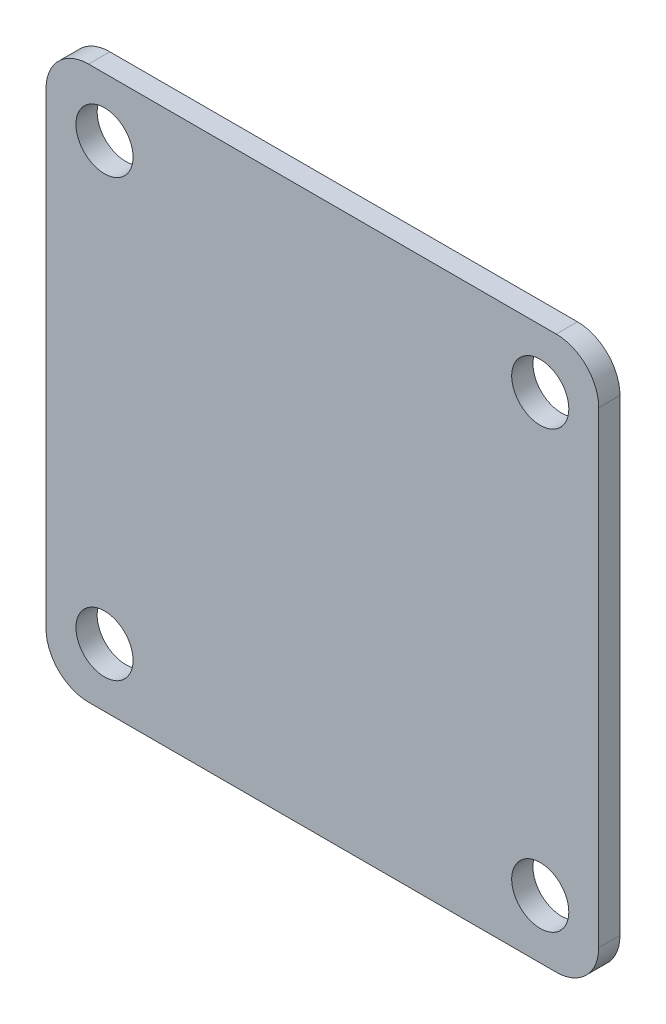
ISO-10303-21;
HEADER;
FILE_DESCRIPTION(('STEP AP214'),'2;1');
FILE_NAME('part.step','',(''),(''),'','','');
FILE_SCHEMA(('AUTOMOTIVE_DESIGN { 1 0 10303 214 1 1 1 1 }'));
ENDSEC;
DATA;
#1=APPLICATION_CONTEXT('core data for automotive mechanical design processes');
#2=APPLICATION_PROTOCOL_DEFINITION('international standard','automotive_design',2000,#1);
#3=PRODUCT_CONTEXT('',#1,'mechanical');
#4=PRODUCT('Part','Part','',(#3));
#5=PRODUCT_RELATED_PRODUCT_CATEGORY('part','',(#4));
#6=PRODUCT_DEFINITION_FORMATION('','',#4);
#7=PRODUCT_DEFINITION_CONTEXT('part definition',#1,'design');
#8=PRODUCT_DEFINITION('design','',#6,#7);
#9=PRODUCT_DEFINITION_SHAPE('','',#8);
#10=(LENGTH_UNIT() NAMED_UNIT(*) SI_UNIT(.MILLI.,.METRE.));
#11=(NAMED_UNIT(*) PLANE_ANGLE_UNIT() SI_UNIT($,.RADIAN.));
#12=(NAMED_UNIT(*) SI_UNIT($,.STERADIAN.) SOLID_ANGLE_UNIT());
#13=UNCERTAINTY_MEASURE_WITH_UNIT(LENGTH_MEASURE(1.E-05),#10,'distance_accuracy_value','');
#14=(GEOMETRIC_REPRESENTATION_CONTEXT(3) GLOBAL_UNCERTAINTY_ASSIGNED_CONTEXT((#13)) GLOBAL_UNIT_ASSIGNED_CONTEXT((#10,
#11,#12)) REPRESENTATION_CONTEXT('',''));
#15=CARTESIAN_POINT('',(0.,0.,0.));
#16=DIRECTION('',(0.,0.,1.));
#17=DIRECTION('',(1.,0.,0.));
#18=AXIS2_PLACEMENT_3D('',#15,#16,#17);
#19=CARTESIAN_POINT('',(-82.55,82.55,6.35));
#20=DIRECTION('',(0.,0.,-1.));
#21=DIRECTION('',(-1.,0.,0.));
#22=AXIS2_PLACEMENT_3D('',#19,#20,#21);
#23=PLANE('',#22);
#24=CARTESIAN_POINT('',(65.0874999999995,65.0875000000004,6.35));
#25=DIRECTION('',(0.,0.,1.));
#26=DIRECTION('',(1.,0.,0.));
#27=AXIS2_PLACEMENT_3D('',#24,#25,#26);
#28=CIRCLE('',#27,8.5328125);
#29=CARTESIAN_POINT('',(73.6203124999995,65.0875000000004,6.35));
#30=VERTEX_POINT('',#29);
#31=EDGE_CURVE('E184',#30,#30,#28,.T.);
#32=ORIENTED_EDGE('',*,*,#31,.F.);
#33=EDGE_LOOP('',(#32));
#34=FACE_BOUND('',#33,.T.);
#35=CARTESIAN_POINT('',(-65.0875,-65.0875,6.35));
#36=DIRECTION('',(0.,0.,1.));
#37=DIRECTION('',(1.,0.,0.));
#38=AXIS2_PLACEMENT_3D('',#35,#36,#37);
#39=CIRCLE('',#38,8.5328125);
#40=CARTESIAN_POINT('',(-56.5546875,-65.0875,6.35));
#41=VERTEX_POINT('',#40);
#42=EDGE_CURVE('E125',#41,#41,#39,.T.);
#43=ORIENTED_EDGE('',*,*,#42,.F.);
#44=EDGE_LOOP('',(#43));
#45=FACE_BOUND('',#44,.T.);
#46=DIRECTION('',(-1.,0.,0.));
#47=VECTOR('',#46,1.);
#48=CARTESIAN_POINT('',(-82.55,82.55,6.35));
#49=LINE('',#48,#47);
#50=CARTESIAN_POINT('',(69.85,82.55,6.35));
#51=VERTEX_POINT('',#50);
#52=CARTESIAN_POINT('',(-69.85,82.55,6.35));
#53=VERTEX_POINT('',#52);
#54=EDGE_CURVE('E134',#51,#53,#49,.T.);
#55=ORIENTED_EDGE('',*,*,#54,.T.);
#56=CARTESIAN_POINT('',(-69.85,69.85,6.35));
#57=DIRECTION('',(0.,0.,-1.));
#58=DIRECTION('',(-1.,0.,0.));
#59=AXIS2_PLACEMENT_3D('',#56,#57,#58);
#60=CIRCLE('',#59,12.7);
#61=CARTESIAN_POINT('',(-82.55,69.85,6.35));
#62=VERTEX_POINT('',#61);
#63=EDGE_CURVE('E153',#53,#62,#60,.F.);
#64=ORIENTED_EDGE('',*,*,#63,.T.);
#65=DIRECTION('',(0.,-1.,0.));
#66=VECTOR('',#65,1.);
#67=CARTESIAN_POINT('',(-82.55,-82.55,6.35));
#68=LINE('',#67,#66);
#69=CARTESIAN_POINT('',(-82.55,-69.85,6.35));
#70=VERTEX_POINT('',#69);
#71=EDGE_CURVE('E117',#62,#70,#68,.T.);
#72=ORIENTED_EDGE('',*,*,#71,.T.);
#73=CARTESIAN_POINT('',(-69.85,-69.85,6.35));
#74=DIRECTION('',(0.,0.,-1.));
#75=DIRECTION('',(-1.,0.,0.));
#76=AXIS2_PLACEMENT_3D('',#73,#74,#75);
#77=CIRCLE('',#76,12.7);
#78=CARTESIAN_POINT('',(-69.85,-82.55,6.35));
#79=VERTEX_POINT('',#78);
#80=EDGE_CURVE('E151',#70,#79,#77,.F.);
#81=ORIENTED_EDGE('',*,*,#80,.T.);
#82=DIRECTION('',(1.,0.,0.));
#83=VECTOR('',#82,1.);
#84=CARTESIAN_POINT('',(-82.55,-82.55,6.35));
#85=LINE('',#84,#83);
#86=CARTESIAN_POINT('',(69.85,-82.55,6.35));
#87=VERTEX_POINT('',#86);
#88=EDGE_CURVE('E164',#79,#87,#85,.T.);
#89=ORIENTED_EDGE('',*,*,#88,.T.);
#90=CARTESIAN_POINT('',(69.85,-69.85,6.35));
#91=DIRECTION('',(0.,0.,-1.));
#92=DIRECTION('',(-1.,0.,0.));
#93=AXIS2_PLACEMENT_3D('',#90,#91,#92);
#94=CIRCLE('',#93,12.7);
#95=CARTESIAN_POINT('',(82.55,-69.85,6.35));
#96=VERTEX_POINT('',#95);
#97=EDGE_CURVE('E52',#87,#96,#94,.F.);
#98=ORIENTED_EDGE('',*,*,#97,.T.);
#99=DIRECTION('',(0.,1.,0.));
#100=VECTOR('',#99,1.);
#101=CARTESIAN_POINT('',(82.55,-82.55,6.35));
#102=LINE('',#101,#100);
#103=CARTESIAN_POINT('',(82.55,69.85,6.35));
#104=VERTEX_POINT('',#103);
#105=EDGE_CURVE('E172',#96,#104,#102,.T.);
#106=ORIENTED_EDGE('',*,*,#105,.T.);
#107=CARTESIAN_POINT('',(69.85,69.85,6.35));
#108=DIRECTION('',(0.,0.,-1.));
#109=DIRECTION('',(-1.,0.,0.));
#110=AXIS2_PLACEMENT_3D('',#107,#108,#109);
#111=CIRCLE('',#110,12.7);
#112=EDGE_CURVE('E148',#104,#51,#111,.F.);
#113=ORIENTED_EDGE('',*,*,#112,.T.);
#114=EDGE_LOOP('',(#55,#64,#72,#81,#89,#98,#106,#113));
#115=FACE_BOUND('',#114,.T.);
#116=CARTESIAN_POINT('',(-65.0875000000007,65.0874999999993,6.35));
#117=DIRECTION('',(0.,0.,1.));
#118=DIRECTION('',(1.,0.,0.));
#119=AXIS2_PLACEMENT_3D('',#116,#117,#118);
#120=CIRCLE('',#119,8.5328125);
#121=CARTESIAN_POINT('',(-56.5546875000007,65.0874999999993,6.35));
#122=VERTEX_POINT('',#121);
#123=EDGE_CURVE('E179',#122,#122,#120,.T.);
#124=ORIENTED_EDGE('',*,*,#123,.F.);
#125=EDGE_LOOP('',(#124));
#126=FACE_BOUND('',#125,.T.);
#127=CARTESIAN_POINT('',(65.0875000000002,-65.0874999999998,6.35));
#128=DIRECTION('',(0.,0.,1.));
#129=DIRECTION('',(1.,0.,0.));
#130=AXIS2_PLACEMENT_3D('',#127,#128,#129);
#131=CIRCLE('',#130,8.5328125);
#132=CARTESIAN_POINT('',(73.6203125000002,-65.0874999999998,6.35));
#133=VERTEX_POINT('',#132);
#134=EDGE_CURVE('E190',#133,#133,#131,.T.);
#135=ORIENTED_EDGE('',*,*,#134,.F.);
#136=EDGE_LOOP('',(#135));
#137=FACE_BOUND('',#136,.T.);
#138=ADVANCED_FACE('F31',(#34,#45,#115,#126,#137),#23,.F.);
#139=CARTESIAN_POINT('',(-82.55,82.55,0.));
#140=DIRECTION('',(0.,0.,-1.));
#141=DIRECTION('',(-1.,0.,0.));
#142=AXIS2_PLACEMENT_3D('',#139,#140,#141);
#143=PLANE('',#142);
#144=CARTESIAN_POINT('',(65.0874999999995,65.0875000000004,0.));
#145=DIRECTION('',(0.,0.,1.));
#146=DIRECTION('',(1.,0.,0.));
#147=AXIS2_PLACEMENT_3D('',#144,#145,#146);
#148=CIRCLE('',#147,8.5328125);
#149=CARTESIAN_POINT('',(73.6203124999995,65.0875000000004,0.));
#150=VERTEX_POINT('',#149);
#151=EDGE_CURVE('E187',#150,#150,#148,.T.);
#152=ORIENTED_EDGE('',*,*,#151,.T.);
#153=EDGE_LOOP('',(#152));
#154=FACE_BOUND('',#153,.T.);
#155=CARTESIAN_POINT('',(-65.0875,-65.0875,0.));
#156=DIRECTION('',(0.,0.,1.));
#157=DIRECTION('',(1.,0.,0.));
#158=AXIS2_PLACEMENT_3D('',#155,#156,#157);
#159=CIRCLE('',#158,8.5328125);
#160=CARTESIAN_POINT('',(-56.5546875,-65.0875,0.));
#161=VERTEX_POINT('',#160);
#162=EDGE_CURVE('E131',#161,#161,#159,.T.);
#163=ORIENTED_EDGE('',*,*,#162,.T.);
#164=EDGE_LOOP('',(#163));
#165=FACE_BOUND('',#164,.T.);
#166=DIRECTION('',(0.,-1.,0.));
#167=VECTOR('',#166,1.);
#168=CARTESIAN_POINT('',(-82.55,-82.55,0.));
#169=LINE('',#168,#167);
#170=CARTESIAN_POINT('',(-82.55,69.85,0.));
#171=VERTEX_POINT('',#170);
#172=CARTESIAN_POINT('',(-82.55,-69.85,0.));
#173=VERTEX_POINT('',#172);
#174=EDGE_CURVE('E114',#171,#173,#169,.T.);
#175=ORIENTED_EDGE('',*,*,#174,.F.);
#176=CARTESIAN_POINT('',(-69.85,69.85,0.));
#177=DIRECTION('',(0.,0.,-1.));
#178=DIRECTION('',(-1.,0.,0.));
#179=AXIS2_PLACEMENT_3D('',#176,#177,#178);
#180=CIRCLE('',#179,12.7);
#181=CARTESIAN_POINT('',(-69.85,82.55,0.));
#182=VERTEX_POINT('',#181);
#183=EDGE_CURVE('E97',#171,#182,#180,.T.);
#184=ORIENTED_EDGE('',*,*,#183,.T.);
#185=DIRECTION('',(-1.,0.,0.));
#186=VECTOR('',#185,1.);
#187=CARTESIAN_POINT('',(-82.55,82.55,0.));
#188=LINE('',#187,#186);
#189=CARTESIAN_POINT('',(69.85,82.55,0.));
#190=VERTEX_POINT('',#189);
#191=EDGE_CURVE('E138',#190,#182,#188,.T.);
#192=ORIENTED_EDGE('',*,*,#191,.F.);
#193=CARTESIAN_POINT('',(69.85,69.85,0.));
#194=DIRECTION('',(0.,0.,-1.));
#195=DIRECTION('',(-1.,0.,0.));
#196=AXIS2_PLACEMENT_3D('',#193,#194,#195);
#197=CIRCLE('',#196,12.7);
#198=CARTESIAN_POINT('',(82.55,69.85,0.));
#199=VERTEX_POINT('',#198);
#200=EDGE_CURVE('E118',#190,#199,#197,.T.);
#201=ORIENTED_EDGE('',*,*,#200,.T.);
#202=DIRECTION('',(0.,1.,0.));
#203=VECTOR('',#202,1.);
#204=CARTESIAN_POINT('',(82.55,-82.55,0.));
#205=LINE('',#204,#203);
#206=CARTESIAN_POINT('',(82.55,-69.85,0.));
#207=VERTEX_POINT('',#206);
#208=EDGE_CURVE('E128',#207,#199,#205,.T.);
#209=ORIENTED_EDGE('',*,*,#208,.F.);
#210=CARTESIAN_POINT('',(69.85,-69.85,0.));
#211=DIRECTION('',(0.,0.,-1.));
#212=DIRECTION('',(-1.,0.,0.));
#213=AXIS2_PLACEMENT_3D('',#210,#211,#212);
#214=CIRCLE('',#213,12.7);
#215=CARTESIAN_POINT('',(69.85,-82.55,0.));
#216=VERTEX_POINT('',#215);
#217=EDGE_CURVE('E142',#207,#216,#214,.T.);
#218=ORIENTED_EDGE('',*,*,#217,.T.);
#219=DIRECTION('',(1.,0.,0.));
#220=VECTOR('',#219,1.);
#221=CARTESIAN_POINT('',(-82.55,-82.55,0.));
#222=LINE('',#221,#220);
#223=CARTESIAN_POINT('',(-69.85,-82.55,0.));
#224=VERTEX_POINT('',#223);
#225=EDGE_CURVE('E124',#224,#216,#222,.T.);
#226=ORIENTED_EDGE('',*,*,#225,.F.);
#227=CARTESIAN_POINT('',(-69.85,-69.85,0.));
#228=DIRECTION('',(0.,0.,-1.));
#229=DIRECTION('',(-1.,0.,0.));
#230=AXIS2_PLACEMENT_3D('',#227,#228,#229);
#231=CIRCLE('',#230,12.7);
#232=EDGE_CURVE('E108',#224,#173,#231,.T.);
#233=ORIENTED_EDGE('',*,*,#232,.T.);
#234=EDGE_LOOP('',(#175,#184,#192,#201,#209,#218,#226,#233));
#235=FACE_BOUND('',#234,.T.);
#236=CARTESIAN_POINT('',(-65.0875000000007,65.0874999999993,0.));
#237=DIRECTION('',(0.,0.,1.));
#238=DIRECTION('',(1.,0.,0.));
#239=AXIS2_PLACEMENT_3D('',#236,#237,#238);
#240=CIRCLE('',#239,8.5328125);
#241=CARTESIAN_POINT('',(-56.5546875000007,65.0874999999993,0.));
#242=VERTEX_POINT('',#241);
#243=EDGE_CURVE('E181',#242,#242,#240,.T.);
#244=ORIENTED_EDGE('',*,*,#243,.T.);
#245=EDGE_LOOP('',(#244));
#246=FACE_BOUND('',#245,.T.);
#247=CARTESIAN_POINT('',(65.0875000000002,-65.0874999999998,0.));
#248=DIRECTION('',(0.,0.,1.));
#249=DIRECTION('',(1.,0.,0.));
#250=AXIS2_PLACEMENT_3D('',#247,#248,#249);
#251=CIRCLE('',#250,8.5328125);
#252=CARTESIAN_POINT('',(73.6203125000002,-65.0874999999998,0.));
#253=VERTEX_POINT('',#252);
#254=EDGE_CURVE('E193',#253,#253,#251,.T.);
#255=ORIENTED_EDGE('',*,*,#254,.T.);
#256=EDGE_LOOP('',(#255));
#257=FACE_BOUND('',#256,.T.);
#258=ADVANCED_FACE('F121',(#154,#165,#235,#246,#257),#143,.T.);
#259=CARTESIAN_POINT('',(-82.55,-82.55,6.35));
#260=DIRECTION('',(1.,0.,0.));
#261=DIRECTION('',(0.,0.,-1.));
#262=AXIS2_PLACEMENT_3D('',#259,#260,#261);
#263=PLANE('',#262);
#264=ORIENTED_EDGE('',*,*,#71,.F.);
#265=DIRECTION('',(0.,0.,-1.));
#266=VECTOR('',#265,1.);
#267=CARTESIAN_POINT('',(-82.55,69.85,6.35));
#268=LINE('',#267,#266);
#269=EDGE_CURVE('E101',#62,#171,#268,.T.);
#270=ORIENTED_EDGE('',*,*,#269,.T.);
#271=ORIENTED_EDGE('',*,*,#174,.T.);
#272=DIRECTION('',(0.,0.,-1.));
#273=VECTOR('',#272,1.);
#274=CARTESIAN_POINT('',(-82.55,-69.85,6.35));
#275=LINE('',#274,#273);
#276=EDGE_CURVE('E119',#173,#70,#275,.F.);
#277=ORIENTED_EDGE('',*,*,#276,.T.);
#278=EDGE_LOOP('',(#264,#270,#271,#277));
#279=FACE_BOUND('',#278,.T.);
#280=ADVANCED_FACE('F113',(#279),#263,.F.);
#281=CARTESIAN_POINT('',(-82.55,-82.55,6.35));
#282=DIRECTION('',(0.,1.,0.));
#283=DIRECTION('',(0.,0.,1.));
#284=AXIS2_PLACEMENT_3D('',#281,#282,#283);
#285=PLANE('',#284);
#286=ORIENTED_EDGE('',*,*,#88,.F.);
#287=DIRECTION('',(0.,0.,-1.));
#288=VECTOR('',#287,1.);
#289=CARTESIAN_POINT('',(-69.85,-82.55,6.35));
#290=LINE('',#289,#288);
#291=EDGE_CURVE('E157',#79,#224,#290,.T.);
#292=ORIENTED_EDGE('',*,*,#291,.T.);
#293=ORIENTED_EDGE('',*,*,#225,.T.);
#294=DIRECTION('',(0.,0.,-1.));
#295=VECTOR('',#294,1.);
#296=CARTESIAN_POINT('',(69.85,-82.55,6.35));
#297=LINE('',#296,#295);
#298=EDGE_CURVE('E155',#216,#87,#297,.F.);
#299=ORIENTED_EDGE('',*,*,#298,.T.);
#300=EDGE_LOOP('',(#286,#292,#293,#299));
#301=FACE_BOUND('',#300,.T.);
#302=ADVANCED_FACE('F162',(#301),#285,.F.);
#303=CARTESIAN_POINT('',(82.55,-82.55,6.35));
#304=DIRECTION('',(-1.,0.,0.));
#305=DIRECTION('',(0.,0.,1.));
#306=AXIS2_PLACEMENT_3D('',#303,#304,#305);
#307=PLANE('',#306);
#308=ORIENTED_EDGE('',*,*,#105,.F.);
#309=DIRECTION('',(0.,0.,-1.));
#310=VECTOR('',#309,1.);
#311=CARTESIAN_POINT('',(82.55,-69.85,6.35));
#312=LINE('',#311,#310);
#313=EDGE_CURVE('E11',#96,#207,#312,.T.);
#314=ORIENTED_EDGE('',*,*,#313,.T.);
#315=ORIENTED_EDGE('',*,*,#208,.T.);
#316=DIRECTION('',(0.,0.,-1.));
#317=VECTOR('',#316,1.);
#318=CARTESIAN_POINT('',(82.55,69.85,6.35));
#319=LINE('',#318,#317);
#320=EDGE_CURVE('E39',#199,#104,#319,.F.);
#321=ORIENTED_EDGE('',*,*,#320,.T.);
#322=EDGE_LOOP('',(#308,#314,#315,#321));
#323=FACE_BOUND('',#322,.T.);
#324=ADVANCED_FACE('F171',(#323),#307,.F.);
#325=CARTESIAN_POINT('',(-82.55,82.55,6.35));
#326=DIRECTION('',(0.,-1.,0.));
#327=DIRECTION('',(0.,0.,-1.));
#328=AXIS2_PLACEMENT_3D('',#325,#326,#327);
#329=PLANE('',#328);
#330=ORIENTED_EDGE('',*,*,#191,.T.);
#331=DIRECTION('',(0.,0.,-1.));
#332=VECTOR('',#331,1.);
#333=CARTESIAN_POINT('',(-69.85,82.55,6.35));
#334=LINE('',#333,#332);
#335=EDGE_CURVE('E102',#182,#53,#334,.F.);
#336=ORIENTED_EDGE('',*,*,#335,.T.);
#337=ORIENTED_EDGE('',*,*,#54,.F.);
#338=DIRECTION('',(0.,0.,-1.));
#339=VECTOR('',#338,1.);
#340=CARTESIAN_POINT('',(69.85,82.55,6.35));
#341=LINE('',#340,#339);
#342=EDGE_CURVE('E107',#51,#190,#341,.T.);
#343=ORIENTED_EDGE('',*,*,#342,.T.);
#344=EDGE_LOOP('',(#330,#336,#337,#343));
#345=FACE_BOUND('',#344,.T.);
#346=ADVANCED_FACE('F216',(#345),#329,.F.);
#347=CARTESIAN_POINT('',(-65.0875,-65.0875,6.35));
#348=DIRECTION('',(0.,0.,-1.));
#349=DIRECTION('',(-1.,0.,0.));
#350=AXIS2_PLACEMENT_3D('',#347,#348,#349);
#351=CYLINDRICAL_SURFACE('',#350,8.5328125);
#352=ORIENTED_EDGE('',*,*,#42,.T.);
#353=EDGE_LOOP('',(#352));
#354=FACE_BOUND('',#353,.T.);
#355=ORIENTED_EDGE('',*,*,#162,.F.);
#356=EDGE_LOOP('',(#355));
#357=FACE_BOUND('',#356,.T.);
#358=ADVANCED_FACE('F213',(#354,#357),#351,.F.);
#359=CARTESIAN_POINT('',(-65.0875000000007,65.0874999999993,6.35));
#360=DIRECTION('',(0.,0.,-1.));
#361=DIRECTION('',(-1.,0.,0.));
#362=AXIS2_PLACEMENT_3D('',#359,#360,#361);
#363=CYLINDRICAL_SURFACE('',#362,8.5328125);
#364=ORIENTED_EDGE('',*,*,#123,.T.);
#365=EDGE_LOOP('',(#364));
#366=FACE_BOUND('',#365,.T.);
#367=ORIENTED_EDGE('',*,*,#243,.F.);
#368=EDGE_LOOP('',(#367));
#369=FACE_BOUND('',#368,.T.);
#370=ADVANCED_FACE('F242',(#366,#369),#363,.F.);
#371=CARTESIAN_POINT('',(65.0874999999995,65.0875000000004,6.35));
#372=DIRECTION('',(0.,0.,-1.));
#373=DIRECTION('',(-1.,0.,0.));
#374=AXIS2_PLACEMENT_3D('',#371,#372,#373);
#375=CYLINDRICAL_SURFACE('',#374,8.5328125);
#376=ORIENTED_EDGE('',*,*,#31,.T.);
#377=EDGE_LOOP('',(#376));
#378=FACE_BOUND('',#377,.T.);
#379=ORIENTED_EDGE('',*,*,#151,.F.);
#380=EDGE_LOOP('',(#379));
#381=FACE_BOUND('',#380,.T.);
#382=ADVANCED_FACE('F245',(#378,#381),#375,.F.);
#383=CARTESIAN_POINT('',(65.0875000000002,-65.0874999999998,6.35));
#384=DIRECTION('',(0.,0.,-1.));
#385=DIRECTION('',(-1.,0.,0.));
#386=AXIS2_PLACEMENT_3D('',#383,#384,#385);
#387=CYLINDRICAL_SURFACE('',#386,8.5328125);
#388=ORIENTED_EDGE('',*,*,#134,.T.);
#389=EDGE_LOOP('',(#388));
#390=FACE_BOUND('',#389,.T.);
#391=ORIENTED_EDGE('',*,*,#254,.F.);
#392=EDGE_LOOP('',(#391));
#393=FACE_BOUND('',#392,.T.);
#394=ADVANCED_FACE('F199',(#390,#393),#387,.F.);
#395=CARTESIAN_POINT('',(-69.85,69.85,6.35));
#396=DIRECTION('',(0.,0.,-1.));
#397=DIRECTION('',(-1.,0.,0.));
#398=AXIS2_PLACEMENT_3D('',#395,#396,#397);
#399=CYLINDRICAL_SURFACE('',#398,12.7);
#400=ORIENTED_EDGE('',*,*,#63,.F.);
#401=ORIENTED_EDGE('',*,*,#335,.F.);
#402=ORIENTED_EDGE('',*,*,#183,.F.);
#403=ORIENTED_EDGE('',*,*,#269,.F.);
#404=EDGE_LOOP('',(#400,#401,#402,#403));
#405=FACE_BOUND('',#404,.T.);
#406=ADVANCED_FACE('F100',(#405),#399,.T.);
#407=CARTESIAN_POINT('',(-69.85,-69.85,6.35));
#408=DIRECTION('',(0.,0.,-1.));
#409=DIRECTION('',(-1.,0.,0.));
#410=AXIS2_PLACEMENT_3D('',#407,#408,#409);
#411=CYLINDRICAL_SURFACE('',#410,12.7);
#412=ORIENTED_EDGE('',*,*,#80,.F.);
#413=ORIENTED_EDGE('',*,*,#276,.F.);
#414=ORIENTED_EDGE('',*,*,#232,.F.);
#415=ORIENTED_EDGE('',*,*,#291,.F.);
#416=EDGE_LOOP('',(#412,#413,#414,#415));
#417=FACE_BOUND('',#416,.T.);
#418=ADVANCED_FACE('F228',(#417),#411,.T.);
#419=CARTESIAN_POINT('',(69.85,-69.85,6.35));
#420=DIRECTION('',(0.,0.,-1.));
#421=DIRECTION('',(-1.,0.,0.));
#422=AXIS2_PLACEMENT_3D('',#419,#420,#421);
#423=CYLINDRICAL_SURFACE('',#422,12.7);
#424=ORIENTED_EDGE('',*,*,#97,.F.);
#425=ORIENTED_EDGE('',*,*,#298,.F.);
#426=ORIENTED_EDGE('',*,*,#217,.F.);
#427=ORIENTED_EDGE('',*,*,#313,.F.);
#428=EDGE_LOOP('',(#424,#425,#426,#427));
#429=FACE_BOUND('',#428,.T.);
#430=ADVANCED_FACE('F170',(#429),#423,.T.);
#431=CARTESIAN_POINT('',(69.85,69.85,6.35));
#432=DIRECTION('',(0.,0.,-1.));
#433=DIRECTION('',(-1.,0.,0.));
#434=AXIS2_PLACEMENT_3D('',#431,#432,#433);
#435=CYLINDRICAL_SURFACE('',#434,12.7);
#436=ORIENTED_EDGE('',*,*,#112,.F.);
#437=ORIENTED_EDGE('',*,*,#320,.F.);
#438=ORIENTED_EDGE('',*,*,#200,.F.);
#439=ORIENTED_EDGE('',*,*,#342,.F.);
#440=EDGE_LOOP('',(#436,#437,#438,#439));
#441=FACE_BOUND('',#440,.T.);
#442=ADVANCED_FACE('F33',(#441),#435,.T.);
#443=CLOSED_SHELL('',(#138,#258,#280,#302,#324,#346,#358,#370,#382,#394,#406,#418,#430,#442));
#444=MANIFOLD_SOLID_BREP('B2',#443);
#445=ADVANCED_BREP_SHAPE_REPRESENTATION('',(#18,#444),#14);
#446=SHAPE_DEFINITION_REPRESENTATION(#9,#445);
ENDSEC;
END-ISO-10303-21;
